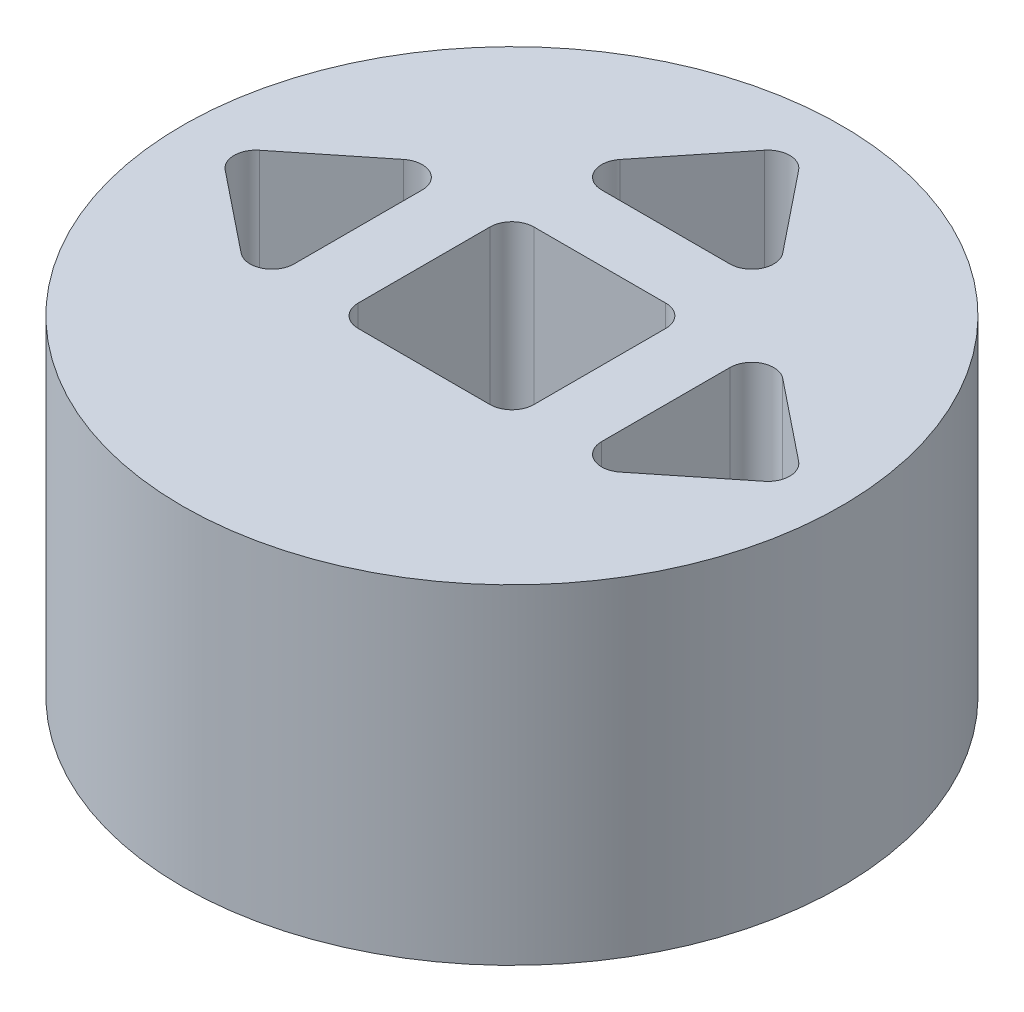
ISO-10303-21;
HEADER;
FILE_DESCRIPTION(('STEP AP214'),'2;1');
FILE_NAME('part.step','',(''),(''),'','','');
FILE_SCHEMA(('AUTOMOTIVE_DESIGN { 1 0 10303 214 1 1 1 1 }'));
ENDSEC;
DATA;
#1=APPLICATION_CONTEXT('core data for automotive mechanical design processes');
#2=APPLICATION_PROTOCOL_DEFINITION('international standard','automotive_design',2000,#1);
#3=PRODUCT_CONTEXT('',#1,'mechanical');
#4=PRODUCT('Part','Part','',(#3));
#5=PRODUCT_RELATED_PRODUCT_CATEGORY('part','',(#4));
#6=PRODUCT_DEFINITION_FORMATION('','',#4);
#7=PRODUCT_DEFINITION_CONTEXT('part definition',#1,'design');
#8=PRODUCT_DEFINITION('design','',#6,#7);
#9=PRODUCT_DEFINITION_SHAPE('','',#8);
#10=(LENGTH_UNIT() NAMED_UNIT(*) SI_UNIT(.MILLI.,.METRE.));
#11=(NAMED_UNIT(*) PLANE_ANGLE_UNIT() SI_UNIT($,.RADIAN.));
#12=(NAMED_UNIT(*) SI_UNIT($,.STERADIAN.) SOLID_ANGLE_UNIT());
#13=UNCERTAINTY_MEASURE_WITH_UNIT(LENGTH_MEASURE(1.E-05),#10,'distance_accuracy_value','');
#14=(GEOMETRIC_REPRESENTATION_CONTEXT(3) GLOBAL_UNCERTAINTY_ASSIGNED_CONTEXT((#13)) GLOBAL_UNIT_ASSIGNED_CONTEXT((#10,
#11,#12)) REPRESENTATION_CONTEXT('',''));
#15=CARTESIAN_POINT('',(0.,0.,0.));
#16=DIRECTION('',(0.,0.,1.));
#17=DIRECTION('',(1.,0.,0.));
#18=AXIS2_PLACEMENT_3D('',#15,#16,#17);
#19=CARTESIAN_POINT('',(0.,15.,0.));
#20=DIRECTION('',(0.,-1.,0.));
#21=DIRECTION('',(0.,0.,-1.));
#22=AXIS2_PLACEMENT_3D('',#19,#20,#21);
#23=CYLINDRICAL_SURFACE('',#22,15.);
#24=CARTESIAN_POINT('',(0.,15.,0.));
#25=DIRECTION('',(0.,1.,0.));
#26=DIRECTION('',(0.,0.,1.));
#27=AXIS2_PLACEMENT_3D('',#24,#25,#26);
#28=CIRCLE('',#27,15.);
#29=CARTESIAN_POINT('',(0.,15.,15.));
#30=VERTEX_POINT('',#29);
#31=EDGE_CURVE('E11',#30,#30,#28,.T.);
#32=ORIENTED_EDGE('',*,*,#31,.F.);
#33=EDGE_LOOP('',(#32));
#34=FACE_BOUND('',#33,.T.);
#35=CARTESIAN_POINT('',(0.,0.,0.));
#36=DIRECTION('',(0.,1.,0.));
#37=DIRECTION('',(0.,0.,1.));
#38=AXIS2_PLACEMENT_3D('',#35,#36,#37);
#39=CIRCLE('',#38,15.);
#40=CARTESIAN_POINT('',(0.,0.,15.));
#41=VERTEX_POINT('',#40);
#42=EDGE_CURVE('E35',#41,#41,#39,.T.);
#43=ORIENTED_EDGE('',*,*,#42,.T.);
#44=EDGE_LOOP('',(#43));
#45=FACE_BOUND('',#44,.T.);
#46=ADVANCED_FACE('F32',(#34,#45),#23,.T.);
#47=CARTESIAN_POINT('',(0.,15.,0.));
#48=DIRECTION('',(0.,1.,0.));
#49=DIRECTION('',(0.,0.,1.));
#50=AXIS2_PLACEMENT_3D('',#47,#48,#49);
#51=PLANE('',#50);
#52=CARTESIAN_POINT('',(-8.,15.,2.91833400053387));
#53=DIRECTION('',(0.,1.,0.));
#54=DIRECTION('',(0.,0.,1.));
#55=AXIS2_PLACEMENT_3D('',#52,#53,#54);
#56=CIRCLE('',#55,1.);
#57=CARTESIAN_POINT('',(-8.62500000000001,15.,3.69895875033366));
#58=VERTEX_POINT('',#57);
#59=CARTESIAN_POINT('',(-7.,15.,2.91833400053385));
#60=VERTEX_POINT('',#59);
#61=EDGE_CURVE('E46',#58,#60,#56,.T.);
#62=ORIENTED_EDGE('',*,*,#61,.F.);
#63=DIRECTION('',(0.7806247497998,0.,0.625));
#64=VECTOR('',#63,1.);
#65=CARTESIAN_POINT('',(-12.2699979983984,15.,0.780624749799806));
#66=LINE('',#65,#64);
#67=CARTESIAN_POINT('',(-12.2699979983984,15.,0.780624749799806));
#68=VERTEX_POINT('',#67);
#69=EDGE_CURVE('E223',#68,#58,#66,.T.);
#70=ORIENTED_EDGE('',*,*,#69,.F.);
#71=CARTESIAN_POINT('',(-11.6449979983984,15.,0.));
#72=DIRECTION('',(0.,1.,0.));
#73=DIRECTION('',(0.,0.,1.));
#74=AXIS2_PLACEMENT_3D('',#71,#72,#73);
#75=CIRCLE('',#74,0.999999999999999);
#76=CARTESIAN_POINT('',(-12.2699979983984,15.,-0.780624749799804));
#77=VERTEX_POINT('',#76);
#78=EDGE_CURVE('E226',#77,#68,#75,.T.);
#79=ORIENTED_EDGE('',*,*,#78,.F.);
#80=DIRECTION('',(-0.7806247497998,0.,0.625));
#81=VECTOR('',#80,1.);
#82=CARTESIAN_POINT('',(-8.62500000000002,15.,-3.69895875033366));
#83=LINE('',#82,#81);
#84=CARTESIAN_POINT('',(-8.62500000000002,15.,-3.69895875033366));
#85=VERTEX_POINT('',#84);
#86=EDGE_CURVE('E242',#85,#77,#83,.T.);
#87=ORIENTED_EDGE('',*,*,#86,.F.);
#88=CARTESIAN_POINT('',(-8.,15.,-2.91833400053387));
#89=DIRECTION('',(0.,1.,0.));
#90=DIRECTION('',(0.,0.,-1.));
#91=AXIS2_PLACEMENT_3D('',#88,#89,#90);
#92=CIRCLE('',#91,1.);
#93=CARTESIAN_POINT('',(-7.,15.,-2.91833400053385));
#94=VERTEX_POINT('',#93);
#95=EDGE_CURVE('E239',#94,#85,#92,.T.);
#96=ORIENTED_EDGE('',*,*,#95,.F.);
#97=DIRECTION('',(0.,0.,-1.));
#98=VECTOR('',#97,1.);
#99=CARTESIAN_POINT('',(-7.,15.,2.91833400053385));
#100=LINE('',#99,#98);
#101=EDGE_CURVE('E237',#60,#94,#100,.T.);
#102=ORIENTED_EDGE('',*,*,#101,.F.);
#103=EDGE_LOOP('',(#62,#70,#79,#87,#96,#102));
#104=FACE_BOUND('',#103,.T.);
#105=CARTESIAN_POINT('',(2.91833400053387,15.,-8.));
#106=DIRECTION('',(0.,1.,0.));
#107=DIRECTION('',(0.,0.,1.));
#108=AXIS2_PLACEMENT_3D('',#105,#106,#107);
#109=CIRCLE('',#108,1.);
#110=CARTESIAN_POINT('',(2.91833400053385,15.,-7.));
#111=VERTEX_POINT('',#110);
#112=CARTESIAN_POINT('',(3.69895875033366,15.,-8.62500000000002));
#113=VERTEX_POINT('',#112);
#114=EDGE_CURVE('E249',#111,#113,#109,.T.);
#115=ORIENTED_EDGE('',*,*,#114,.F.);
#116=DIRECTION('',(1.,0.,0.));
#117=VECTOR('',#116,1.);
#118=CARTESIAN_POINT('',(-2.91833400053385,15.,-7.));
#119=LINE('',#118,#117);
#120=CARTESIAN_POINT('',(-2.91833400053385,15.,-7.));
#121=VERTEX_POINT('',#120);
#122=EDGE_CURVE('E261',#121,#111,#119,.T.);
#123=ORIENTED_EDGE('',*,*,#122,.F.);
#124=CARTESIAN_POINT('',(-2.91833400053386,15.,-8.));
#125=DIRECTION('',(0.,1.,0.));
#126=DIRECTION('',(0.,0.,1.));
#127=AXIS2_PLACEMENT_3D('',#124,#125,#126);
#128=CIRCLE('',#127,1.);
#129=CARTESIAN_POINT('',(-3.69895875033365,15.,-8.62500000000002));
#130=VERTEX_POINT('',#129);
#131=EDGE_CURVE('E287',#130,#121,#128,.T.);
#132=ORIENTED_EDGE('',*,*,#131,.F.);
#133=DIRECTION('',(-0.625,0.,0.7806247497998));
#134=VECTOR('',#133,1.);
#135=CARTESIAN_POINT('',(-0.780624749799804,15.,-12.2699979983984));
#136=LINE('',#135,#134);
#137=CARTESIAN_POINT('',(-0.780624749799804,15.,-12.2699979983984));
#138=VERTEX_POINT('',#137);
#139=EDGE_CURVE('E284',#138,#130,#136,.T.);
#140=ORIENTED_EDGE('',*,*,#139,.F.);
#141=CARTESIAN_POINT('',(0.,15.,-11.6449979983984));
#142=DIRECTION('',(0.,1.,0.));
#143=DIRECTION('',(0.,0.,-1.));
#144=AXIS2_PLACEMENT_3D('',#141,#142,#143);
#145=CIRCLE('',#144,0.999999999999999);
#146=CARTESIAN_POINT('',(0.780624749799806,15.,-12.2699979983984));
#147=VERTEX_POINT('',#146);
#148=EDGE_CURVE('E281',#147,#138,#145,.T.);
#149=ORIENTED_EDGE('',*,*,#148,.F.);
#150=DIRECTION('',(-0.625,0.,-0.7806247497998));
#151=VECTOR('',#150,1.);
#152=CARTESIAN_POINT('',(3.69895875033366,15.,-8.62500000000002));
#153=LINE('',#152,#151);
#154=EDGE_CURVE('E278',#113,#147,#153,.T.);
#155=ORIENTED_EDGE('',*,*,#154,.F.);
#156=EDGE_LOOP('',(#115,#123,#132,#140,#149,#155));
#157=FACE_BOUND('',#156,.T.);
#158=CARTESIAN_POINT('',(8.,15.,2.91833400053387));
#159=DIRECTION('',(0.,1.,0.));
#160=DIRECTION('',(0.,0.,-1.));
#161=AXIS2_PLACEMENT_3D('',#158,#159,#160);
#162=CIRCLE('',#161,1.);
#163=CARTESIAN_POINT('',(7.,15.,2.91833400053385));
#164=VERTEX_POINT('',#163);
#165=CARTESIAN_POINT('',(8.62500000000002,15.,3.69895875033366));
#166=VERTEX_POINT('',#165);
#167=EDGE_CURVE('E294',#164,#166,#162,.T.);
#168=ORIENTED_EDGE('',*,*,#167,.F.);
#169=DIRECTION('',(0.,0.,1.));
#170=VECTOR('',#169,1.);
#171=CARTESIAN_POINT('',(7.,15.,-2.91833400053385));
#172=LINE('',#171,#170);
#173=CARTESIAN_POINT('',(7.,15.,-2.91833400053385));
#174=VERTEX_POINT('',#173);
#175=EDGE_CURVE('E309',#174,#164,#172,.T.);
#176=ORIENTED_EDGE('',*,*,#175,.F.);
#177=CARTESIAN_POINT('',(8.,15.,-2.91833400053387));
#178=DIRECTION('',(0.,1.,0.));
#179=DIRECTION('',(0.,0.,1.));
#180=AXIS2_PLACEMENT_3D('',#177,#178,#179);
#181=CIRCLE('',#180,1.);
#182=CARTESIAN_POINT('',(8.62500000000002,15.,-3.69895875033365));
#183=VERTEX_POINT('',#182);
#184=EDGE_CURVE('E335',#183,#174,#181,.T.);
#185=ORIENTED_EDGE('',*,*,#184,.F.);
#186=DIRECTION('',(-0.7806247497998,0.,-0.625));
#187=VECTOR('',#186,1.);
#188=CARTESIAN_POINT('',(12.2699979983984,15.,-0.780624749799805));
#189=LINE('',#188,#187);
#190=CARTESIAN_POINT('',(12.2699979983984,15.,-0.780624749799805));
#191=VERTEX_POINT('',#190);
#192=EDGE_CURVE('E332',#191,#183,#189,.T.);
#193=ORIENTED_EDGE('',*,*,#192,.F.);
#194=CARTESIAN_POINT('',(11.6449979983984,15.,0.));
#195=DIRECTION('',(0.,1.,0.));
#196=DIRECTION('',(0.,0.,1.));
#197=AXIS2_PLACEMENT_3D('',#194,#195,#196);
#198=CIRCLE('',#197,0.999999999999999);
#199=CARTESIAN_POINT('',(12.2699979983984,15.,0.780624749799805));
#200=VERTEX_POINT('',#199);
#201=EDGE_CURVE('E329',#200,#191,#198,.T.);
#202=ORIENTED_EDGE('',*,*,#201,.F.);
#203=DIRECTION('',(0.7806247497998,0.,-0.625));
#204=VECTOR('',#203,1.);
#205=CARTESIAN_POINT('',(8.62500000000002,15.,3.69895875033366));
#206=LINE('',#205,#204);
#207=EDGE_CURVE('E326',#166,#200,#206,.T.);
#208=ORIENTED_EDGE('',*,*,#207,.F.);
#209=EDGE_LOOP('',(#168,#176,#185,#193,#202,#208));
#210=FACE_BOUND('',#209,.T.);
#211=CARTESIAN_POINT('',(-3.,15.,3.));
#212=DIRECTION('',(0.,1.,0.));
#213=DIRECTION('',(0.,0.,-1.));
#214=AXIS2_PLACEMENT_3D('',#211,#212,#213);
#215=CIRCLE('',#214,1.);
#216=CARTESIAN_POINT('',(-4.,15.,2.99999999999999));
#217=VERTEX_POINT('',#216);
#218=CARTESIAN_POINT('',(-2.99999999999999,15.,4.));
#219=VERTEX_POINT('',#218);
#220=EDGE_CURVE('E342',#217,#219,#215,.T.);
#221=ORIENTED_EDGE('',*,*,#220,.F.);
#222=DIRECTION('',(0.,0.,1.));
#223=VECTOR('',#222,1.);
#224=CARTESIAN_POINT('',(-4.,15.,2.99999999999999));
#225=LINE('',#224,#223);
#226=CARTESIAN_POINT('',(-4.,15.,-2.99999999999999));
#227=VERTEX_POINT('',#226);
#228=EDGE_CURVE('E357',#227,#217,#225,.T.);
#229=ORIENTED_EDGE('',*,*,#228,.F.);
#230=CARTESIAN_POINT('',(-3.,15.,-3.));
#231=DIRECTION('',(0.,1.,0.));
#232=DIRECTION('',(0.,0.,-1.));
#233=AXIS2_PLACEMENT_3D('',#230,#231,#232);
#234=CIRCLE('',#233,1.);
#235=CARTESIAN_POINT('',(-2.99999999999999,15.,-4.));
#236=VERTEX_POINT('',#235);
#237=EDGE_CURVE('E395',#236,#227,#234,.T.);
#238=ORIENTED_EDGE('',*,*,#237,.F.);
#239=DIRECTION('',(-1.,0.,0.));
#240=VECTOR('',#239,1.);
#241=CARTESIAN_POINT('',(-2.99999999999999,15.,-4.));
#242=LINE('',#241,#240);
#243=CARTESIAN_POINT('',(2.99999999999999,15.,-4.));
#244=VERTEX_POINT('',#243);
#245=EDGE_CURVE('E392',#244,#236,#242,.T.);
#246=ORIENTED_EDGE('',*,*,#245,.F.);
#247=CARTESIAN_POINT('',(3.,15.,-3.));
#248=DIRECTION('',(0.,1.,0.));
#249=DIRECTION('',(0.,0.,-1.));
#250=AXIS2_PLACEMENT_3D('',#247,#248,#249);
#251=CIRCLE('',#250,1.);
#252=CARTESIAN_POINT('',(4.,15.,-2.99999999999999));
#253=VERTEX_POINT('',#252);
#254=EDGE_CURVE('E389',#253,#244,#251,.T.);
#255=ORIENTED_EDGE('',*,*,#254,.F.);
#256=DIRECTION('',(0.,0.,-1.));
#257=VECTOR('',#256,1.);
#258=CARTESIAN_POINT('',(4.,15.,2.99999999999999));
#259=LINE('',#258,#257);
#260=CARTESIAN_POINT('',(4.,15.,2.99999999999999));
#261=VERTEX_POINT('',#260);
#262=EDGE_CURVE('E386',#261,#253,#259,.T.);
#263=ORIENTED_EDGE('',*,*,#262,.F.);
#264=CARTESIAN_POINT('',(3.,15.,3.));
#265=DIRECTION('',(0.,1.,0.));
#266=DIRECTION('',(0.,0.,1.));
#267=AXIS2_PLACEMENT_3D('',#264,#265,#266);
#268=CIRCLE('',#267,1.);
#269=CARTESIAN_POINT('',(2.99999999999999,15.,4.));
#270=VERTEX_POINT('',#269);
#271=EDGE_CURVE('E383',#270,#261,#268,.T.);
#272=ORIENTED_EDGE('',*,*,#271,.F.);
#273=DIRECTION('',(1.,0.,0.));
#274=VECTOR('',#273,1.);
#275=CARTESIAN_POINT('',(-2.99999999999999,15.,4.));
#276=LINE('',#275,#274);
#277=EDGE_CURVE('E380',#219,#270,#276,.T.);
#278=ORIENTED_EDGE('',*,*,#277,.F.);
#279=EDGE_LOOP('',(#221,#229,#238,#246,#255,#263,#272,#278));
#280=FACE_BOUND('',#279,.T.);
#281=ORIENTED_EDGE('',*,*,#31,.T.);
#282=EDGE_LOOP('',(#281));
#283=FACE_BOUND('',#282,.T.);
#284=ADVANCED_FACE('F425',(#104,#157,#210,#280,#283),#51,.T.);
#285=CARTESIAN_POINT('',(0.,0.,0.));
#286=DIRECTION('',(0.,1.,0.));
#287=DIRECTION('',(0.,0.,1.));
#288=AXIS2_PLACEMENT_3D('',#285,#286,#287);
#289=PLANE('',#288);
#290=DIRECTION('',(0.7806247497998,0.,0.625));
#291=VECTOR('',#290,1.);
#292=CARTESIAN_POINT('',(-12.2699979983984,0.,0.780624749799806));
#293=LINE('',#292,#291);
#294=CARTESIAN_POINT('',(-12.2699979983984,0.,0.780624749799806));
#295=VERTEX_POINT('',#294);
#296=CARTESIAN_POINT('',(-8.62500000000001,0.,3.69895875033366));
#297=VERTEX_POINT('',#296);
#298=EDGE_CURVE('E212',#295,#297,#293,.T.);
#299=ORIENTED_EDGE('',*,*,#298,.T.);
#300=CARTESIAN_POINT('',(-8.,0.,2.91833400053387));
#301=DIRECTION('',(0.,1.,0.));
#302=DIRECTION('',(0.,0.,1.));
#303=AXIS2_PLACEMENT_3D('',#300,#301,#302);
#304=CIRCLE('',#303,1.);
#305=CARTESIAN_POINT('',(-7.,0.,2.91833400053385));
#306=VERTEX_POINT('',#305);
#307=EDGE_CURVE('E206',#297,#306,#304,.T.);
#308=ORIENTED_EDGE('',*,*,#307,.T.);
#309=DIRECTION('',(0.,0.,-1.));
#310=VECTOR('',#309,1.);
#311=CARTESIAN_POINT('',(-7.,0.,2.91833400053385));
#312=LINE('',#311,#310);
#313=CARTESIAN_POINT('',(-7.,0.,-2.91833400053385));
#314=VERTEX_POINT('',#313);
#315=EDGE_CURVE('E215',#306,#314,#312,.T.);
#316=ORIENTED_EDGE('',*,*,#315,.T.);
#317=CARTESIAN_POINT('',(-8.,0.,-2.91833400053387));
#318=DIRECTION('',(0.,1.,0.));
#319=DIRECTION('',(0.,0.,-1.));
#320=AXIS2_PLACEMENT_3D('',#317,#318,#319);
#321=CIRCLE('',#320,1.);
#322=CARTESIAN_POINT('',(-8.62500000000002,0.,-3.69895875033366));
#323=VERTEX_POINT('',#322);
#324=EDGE_CURVE('E54',#314,#323,#321,.T.);
#325=ORIENTED_EDGE('',*,*,#324,.T.);
#326=DIRECTION('',(-0.7806247497998,0.,0.625));
#327=VECTOR('',#326,1.);
#328=CARTESIAN_POINT('',(-8.62500000000002,0.,-3.69895875033366));
#329=LINE('',#328,#327);
#330=CARTESIAN_POINT('',(-12.2699979983984,0.,-0.780624749799804));
#331=VERTEX_POINT('',#330);
#332=EDGE_CURVE('E230',#323,#331,#329,.T.);
#333=ORIENTED_EDGE('',*,*,#332,.T.);
#334=CARTESIAN_POINT('',(-11.6449979983984,0.,0.));
#335=DIRECTION('',(0.,1.,0.));
#336=DIRECTION('',(0.,0.,1.));
#337=AXIS2_PLACEMENT_3D('',#334,#335,#336);
#338=CIRCLE('',#337,0.999999999999999);
#339=EDGE_CURVE('E233',#331,#295,#338,.T.);
#340=ORIENTED_EDGE('',*,*,#339,.T.);
#341=EDGE_LOOP('',(#299,#308,#316,#325,#333,#340));
#342=FACE_BOUND('',#341,.T.);
#343=DIRECTION('',(1.,0.,0.));
#344=VECTOR('',#343,1.);
#345=CARTESIAN_POINT('',(-2.91833400053385,0.,-7.));
#346=LINE('',#345,#344);
#347=CARTESIAN_POINT('',(-2.91833400053385,0.,-7.));
#348=VERTEX_POINT('',#347);
#349=CARTESIAN_POINT('',(2.91833400053385,0.,-7.));
#350=VERTEX_POINT('',#349);
#351=EDGE_CURVE('E273',#348,#350,#346,.T.);
#352=ORIENTED_EDGE('',*,*,#351,.T.);
#353=CARTESIAN_POINT('',(2.91833400053387,0.,-8.));
#354=DIRECTION('',(0.,1.,0.));
#355=DIRECTION('',(0.,0.,1.));
#356=AXIS2_PLACEMENT_3D('',#353,#354,#355);
#357=CIRCLE('',#356,1.);
#358=CARTESIAN_POINT('',(3.69895875033366,0.,-8.62500000000002));
#359=VERTEX_POINT('',#358);
#360=EDGE_CURVE('E257',#350,#359,#357,.T.);
#361=ORIENTED_EDGE('',*,*,#360,.T.);
#362=DIRECTION('',(-0.625,0.,-0.7806247497998));
#363=VECTOR('',#362,1.);
#364=CARTESIAN_POINT('',(3.69895875033366,0.,-8.62500000000002));
#365=LINE('',#364,#363);
#366=CARTESIAN_POINT('',(0.780624749799808,0.,-12.2699979983984));
#367=VERTEX_POINT('',#366);
#368=EDGE_CURVE('E260',#359,#367,#365,.T.);
#369=ORIENTED_EDGE('',*,*,#368,.T.);
#370=CARTESIAN_POINT('',(0.,0.,-11.6449979983984));
#371=DIRECTION('',(0.,1.,0.));
#372=DIRECTION('',(0.,0.,-1.));
#373=AXIS2_PLACEMENT_3D('',#370,#371,#372);
#374=CIRCLE('',#373,0.999999999999999);
#375=CARTESIAN_POINT('',(-0.780624749799804,0.,-12.2699979983984));
#376=VERTEX_POINT('',#375);
#377=EDGE_CURVE('E264',#367,#376,#374,.T.);
#378=ORIENTED_EDGE('',*,*,#377,.T.);
#379=DIRECTION('',(-0.625,0.,0.7806247497998));
#380=VECTOR('',#379,1.);
#381=CARTESIAN_POINT('',(-0.780624749799804,0.,-12.2699979983984));
#382=LINE('',#381,#380);
#383=CARTESIAN_POINT('',(-3.69895875033365,0.,-8.62500000000002));
#384=VERTEX_POINT('',#383);
#385=EDGE_CURVE('E267',#376,#384,#382,.T.);
#386=ORIENTED_EDGE('',*,*,#385,.T.);
#387=CARTESIAN_POINT('',(-2.91833400053386,0.,-8.));
#388=DIRECTION('',(0.,1.,0.));
#389=DIRECTION('',(0.,0.,1.));
#390=AXIS2_PLACEMENT_3D('',#387,#388,#389);
#391=CIRCLE('',#390,1.);
#392=EDGE_CURVE('E270',#384,#348,#391,.T.);
#393=ORIENTED_EDGE('',*,*,#392,.T.);
#394=EDGE_LOOP('',(#352,#361,#369,#378,#386,#393));
#395=FACE_BOUND('',#394,.T.);
#396=DIRECTION('',(0.,0.,1.));
#397=VECTOR('',#396,1.);
#398=CARTESIAN_POINT('',(7.,0.,-2.91833400053385));
#399=LINE('',#398,#397);
#400=CARTESIAN_POINT('',(7.,0.,-2.91833400053385));
#401=VERTEX_POINT('',#400);
#402=CARTESIAN_POINT('',(7.,0.,2.91833400053385));
#403=VERTEX_POINT('',#402);
#404=EDGE_CURVE('E321',#401,#403,#399,.T.);
#405=ORIENTED_EDGE('',*,*,#404,.T.);
#406=CARTESIAN_POINT('',(8.,0.,2.91833400053387));
#407=DIRECTION('',(0.,1.,0.));
#408=DIRECTION('',(0.,0.,-1.));
#409=AXIS2_PLACEMENT_3D('',#406,#407,#408);
#410=CIRCLE('',#409,1.);
#411=CARTESIAN_POINT('',(8.62500000000002,0.,3.69895875033366));
#412=VERTEX_POINT('',#411);
#413=EDGE_CURVE('E305',#403,#412,#410,.T.);
#414=ORIENTED_EDGE('',*,*,#413,.T.);
#415=DIRECTION('',(0.7806247497998,0.,-0.625));
#416=VECTOR('',#415,1.);
#417=CARTESIAN_POINT('',(8.62500000000002,0.,3.69895875033366));
#418=LINE('',#417,#416);
#419=CARTESIAN_POINT('',(12.2699979983984,0.,0.780624749799804));
#420=VERTEX_POINT('',#419);
#421=EDGE_CURVE('E308',#412,#420,#418,.T.);
#422=ORIENTED_EDGE('',*,*,#421,.T.);
#423=CARTESIAN_POINT('',(11.6449979983984,0.,0.));
#424=DIRECTION('',(0.,1.,0.));
#425=DIRECTION('',(0.,0.,1.));
#426=AXIS2_PLACEMENT_3D('',#423,#424,#425);
#427=CIRCLE('',#426,0.999999999999999);
#428=CARTESIAN_POINT('',(12.2699979983984,0.,-0.780624749799805));
#429=VERTEX_POINT('',#428);
#430=EDGE_CURVE('E312',#420,#429,#427,.T.);
#431=ORIENTED_EDGE('',*,*,#430,.T.);
#432=DIRECTION('',(-0.7806247497998,0.,-0.625));
#433=VECTOR('',#432,1.);
#434=CARTESIAN_POINT('',(12.2699979983984,0.,-0.780624749799805));
#435=LINE('',#434,#433);
#436=CARTESIAN_POINT('',(8.62500000000002,0.,-3.69895875033365));
#437=VERTEX_POINT('',#436);
#438=EDGE_CURVE('E315',#429,#437,#435,.T.);
#439=ORIENTED_EDGE('',*,*,#438,.T.);
#440=CARTESIAN_POINT('',(8.,0.,-2.91833400053387));
#441=DIRECTION('',(0.,1.,0.));
#442=DIRECTION('',(0.,0.,1.));
#443=AXIS2_PLACEMENT_3D('',#440,#441,#442);
#444=CIRCLE('',#443,1.);
#445=EDGE_CURVE('E318',#437,#401,#444,.T.);
#446=ORIENTED_EDGE('',*,*,#445,.T.);
#447=EDGE_LOOP('',(#405,#414,#422,#431,#439,#446));
#448=FACE_BOUND('',#447,.T.);
#449=DIRECTION('',(0.,0.,1.));
#450=VECTOR('',#449,1.);
#451=CARTESIAN_POINT('',(-4.,0.,2.99999999999999));
#452=LINE('',#451,#450);
#453=CARTESIAN_POINT('',(-4.,0.,-2.99999999999999));
#454=VERTEX_POINT('',#453);
#455=CARTESIAN_POINT('',(-4.,0.,2.99999999999999));
#456=VERTEX_POINT('',#455);
#457=EDGE_CURVE('E375',#454,#456,#452,.T.);
#458=ORIENTED_EDGE('',*,*,#457,.T.);
#459=CARTESIAN_POINT('',(-3.,0.,3.));
#460=DIRECTION('',(0.,1.,0.));
#461=DIRECTION('',(0.,0.,-1.));
#462=AXIS2_PLACEMENT_3D('',#459,#460,#461);
#463=CIRCLE('',#462,1.);
#464=CARTESIAN_POINT('',(-2.99999999999999,0.,4.));
#465=VERTEX_POINT('',#464);
#466=EDGE_CURVE('E353',#456,#465,#463,.T.);
#467=ORIENTED_EDGE('',*,*,#466,.T.);
#468=DIRECTION('',(1.,0.,0.));
#469=VECTOR('',#468,1.);
#470=CARTESIAN_POINT('',(-2.99999999999999,0.,4.));
#471=LINE('',#470,#469);
#472=CARTESIAN_POINT('',(2.99999999999999,0.,4.));
#473=VERTEX_POINT('',#472);
#474=EDGE_CURVE('E356',#465,#473,#471,.T.);
#475=ORIENTED_EDGE('',*,*,#474,.T.);
#476=CARTESIAN_POINT('',(3.,0.,3.));
#477=DIRECTION('',(0.,1.,0.));
#478=DIRECTION('',(0.,0.,1.));
#479=AXIS2_PLACEMENT_3D('',#476,#477,#478);
#480=CIRCLE('',#479,1.);
#481=CARTESIAN_POINT('',(4.,0.,2.99999999999999));
#482=VERTEX_POINT('',#481);
#483=EDGE_CURVE('E360',#473,#482,#480,.T.);
#484=ORIENTED_EDGE('',*,*,#483,.T.);
#485=DIRECTION('',(0.,0.,-1.));
#486=VECTOR('',#485,1.);
#487=CARTESIAN_POINT('',(4.,0.,2.99999999999999));
#488=LINE('',#487,#486);
#489=CARTESIAN_POINT('',(4.,0.,-2.99999999999999));
#490=VERTEX_POINT('',#489);
#491=EDGE_CURVE('E363',#482,#490,#488,.T.);
#492=ORIENTED_EDGE('',*,*,#491,.T.);
#493=CARTESIAN_POINT('',(3.,0.,-3.));
#494=DIRECTION('',(0.,1.,0.));
#495=DIRECTION('',(0.,0.,-1.));
#496=AXIS2_PLACEMENT_3D('',#493,#494,#495);
#497=CIRCLE('',#496,1.);
#498=CARTESIAN_POINT('',(2.99999999999999,0.,-4.));
#499=VERTEX_POINT('',#498);
#500=EDGE_CURVE('E366',#490,#499,#497,.T.);
#501=ORIENTED_EDGE('',*,*,#500,.T.);
#502=DIRECTION('',(-1.,0.,0.));
#503=VECTOR('',#502,1.);
#504=CARTESIAN_POINT('',(-2.99999999999999,0.,-4.));
#505=LINE('',#504,#503);
#506=CARTESIAN_POINT('',(-2.99999999999999,0.,-4.));
#507=VERTEX_POINT('',#506);
#508=EDGE_CURVE('E369',#499,#507,#505,.T.);
#509=ORIENTED_EDGE('',*,*,#508,.T.);
#510=CARTESIAN_POINT('',(-3.,0.,-3.));
#511=DIRECTION('',(0.,1.,0.));
#512=DIRECTION('',(0.,0.,-1.));
#513=AXIS2_PLACEMENT_3D('',#510,#511,#512);
#514=CIRCLE('',#513,1.);
#515=EDGE_CURVE('E372',#507,#454,#514,.T.);
#516=ORIENTED_EDGE('',*,*,#515,.T.);
#517=EDGE_LOOP('',(#458,#467,#475,#484,#492,#501,#509,#516));
#518=FACE_BOUND('',#517,.T.);
#519=ORIENTED_EDGE('',*,*,#42,.F.);
#520=EDGE_LOOP('',(#519));
#521=FACE_BOUND('',#520,.T.);
#522=ADVANCED_FACE('F219',(#342,#395,#448,#518,#521),#289,.F.);
#523=CARTESIAN_POINT('',(-3.,0.,3.));
#524=DIRECTION('',(0.,1.,0.));
#525=DIRECTION('',(0.,0.,1.));
#526=AXIS2_PLACEMENT_3D('',#523,#524,#525);
#527=CYLINDRICAL_SURFACE('',#526,1.);
#528=ORIENTED_EDGE('',*,*,#220,.T.);
#529=DIRECTION('',(0.,1.,0.));
#530=VECTOR('',#529,1.);
#531=CARTESIAN_POINT('',(-2.99999999999999,0.,4.));
#532=LINE('',#531,#530);
#533=EDGE_CURVE('E378',#465,#219,#532,.T.);
#534=ORIENTED_EDGE('',*,*,#533,.F.);
#535=ORIENTED_EDGE('',*,*,#466,.F.);
#536=DIRECTION('',(0.,1.,0.));
#537=VECTOR('',#536,1.);
#538=CARTESIAN_POINT('',(-4.,0.,2.99999999999999));
#539=LINE('',#538,#537);
#540=EDGE_CURVE('E400',#456,#217,#539,.T.);
#541=ORIENTED_EDGE('',*,*,#540,.T.);
#542=EDGE_LOOP('',(#528,#534,#535,#541));
#543=FACE_BOUND('',#542,.T.);
#544=ADVANCED_FACE('F436',(#543),#527,.F.);
#545=CARTESIAN_POINT('',(-4.,0.,2.99999999999999));
#546=DIRECTION('',(-1.,0.,0.));
#547=DIRECTION('',(0.,0.,1.));
#548=AXIS2_PLACEMENT_3D('',#545,#546,#547);
#549=PLANE('',#548);
#550=ORIENTED_EDGE('',*,*,#228,.T.);
#551=ORIENTED_EDGE('',*,*,#540,.F.);
#552=ORIENTED_EDGE('',*,*,#457,.F.);
#553=DIRECTION('',(0.,1.,0.));
#554=VECTOR('',#553,1.);
#555=CARTESIAN_POINT('',(-4.,0.,-2.99999999999999));
#556=LINE('',#555,#554);
#557=EDGE_CURVE('E402',#454,#227,#556,.T.);
#558=ORIENTED_EDGE('',*,*,#557,.T.);
#559=EDGE_LOOP('',(#550,#551,#552,#558));
#560=FACE_BOUND('',#559,.T.);
#561=ADVANCED_FACE('F438',(#560),#549,.F.);
#562=CARTESIAN_POINT('',(-3.,0.,-3.));
#563=DIRECTION('',(0.,1.,0.));
#564=DIRECTION('',(0.,0.,1.));
#565=AXIS2_PLACEMENT_3D('',#562,#563,#564);
#566=CYLINDRICAL_SURFACE('',#565,1.);
#567=ORIENTED_EDGE('',*,*,#237,.T.);
#568=ORIENTED_EDGE('',*,*,#557,.F.);
#569=ORIENTED_EDGE('',*,*,#515,.F.);
#570=DIRECTION('',(0.,1.,0.));
#571=VECTOR('',#570,1.);
#572=CARTESIAN_POINT('',(-2.99999999999999,0.,-4.));
#573=LINE('',#572,#571);
#574=EDGE_CURVE('E404',#507,#236,#573,.T.);
#575=ORIENTED_EDGE('',*,*,#574,.T.);
#576=EDGE_LOOP('',(#567,#568,#569,#575));
#577=FACE_BOUND('',#576,.T.);
#578=ADVANCED_FACE('F442',(#577),#566,.F.);
#579=CARTESIAN_POINT('',(-2.99999999999999,0.,-4.));
#580=DIRECTION('',(0.,0.,-1.));
#581=DIRECTION('',(-1.,0.,0.));
#582=AXIS2_PLACEMENT_3D('',#579,#580,#581);
#583=PLANE('',#582);
#584=ORIENTED_EDGE('',*,*,#245,.T.);
#585=ORIENTED_EDGE('',*,*,#574,.F.);
#586=ORIENTED_EDGE('',*,*,#508,.F.);
#587=DIRECTION('',(0.,1.,0.));
#588=VECTOR('',#587,1.);
#589=CARTESIAN_POINT('',(2.99999999999999,0.,-4.));
#590=LINE('',#589,#588);
#591=EDGE_CURVE('E406',#499,#244,#590,.T.);
#592=ORIENTED_EDGE('',*,*,#591,.T.);
#593=EDGE_LOOP('',(#584,#585,#586,#592));
#594=FACE_BOUND('',#593,.T.);
#595=ADVANCED_FACE('F446',(#594),#583,.F.);
#596=CARTESIAN_POINT('',(3.,0.,-3.));
#597=DIRECTION('',(0.,1.,0.));
#598=DIRECTION('',(0.,0.,1.));
#599=AXIS2_PLACEMENT_3D('',#596,#597,#598);
#600=CYLINDRICAL_SURFACE('',#599,1.);
#601=ORIENTED_EDGE('',*,*,#254,.T.);
#602=ORIENTED_EDGE('',*,*,#591,.F.);
#603=ORIENTED_EDGE('',*,*,#500,.F.);
#604=DIRECTION('',(0.,1.,0.));
#605=VECTOR('',#604,1.);
#606=CARTESIAN_POINT('',(4.,0.,-2.99999999999999));
#607=LINE('',#606,#605);
#608=EDGE_CURVE('E408',#490,#253,#607,.T.);
#609=ORIENTED_EDGE('',*,*,#608,.T.);
#610=EDGE_LOOP('',(#601,#602,#603,#609));
#611=FACE_BOUND('',#610,.T.);
#612=ADVANCED_FACE('F449',(#611),#600,.F.);
#613=CARTESIAN_POINT('',(4.,0.,2.99999999999999));
#614=DIRECTION('',(1.,0.,0.));
#615=DIRECTION('',(0.,0.,-1.));
#616=AXIS2_PLACEMENT_3D('',#613,#614,#615);
#617=PLANE('',#616);
#618=ORIENTED_EDGE('',*,*,#262,.T.);
#619=ORIENTED_EDGE('',*,*,#608,.F.);
#620=ORIENTED_EDGE('',*,*,#491,.F.);
#621=DIRECTION('',(0.,1.,0.));
#622=VECTOR('',#621,1.);
#623=CARTESIAN_POINT('',(4.,0.,2.99999999999999));
#624=LINE('',#623,#622);
#625=EDGE_CURVE('E410',#482,#261,#624,.T.);
#626=ORIENTED_EDGE('',*,*,#625,.T.);
#627=EDGE_LOOP('',(#618,#619,#620,#626));
#628=FACE_BOUND('',#627,.T.);
#629=ADVANCED_FACE('F451',(#628),#617,.F.);
#630=CARTESIAN_POINT('',(3.,0.,3.));
#631=DIRECTION('',(0.,1.,0.));
#632=DIRECTION('',(0.,0.,1.));
#633=AXIS2_PLACEMENT_3D('',#630,#631,#632);
#634=CYLINDRICAL_SURFACE('',#633,1.);
#635=ORIENTED_EDGE('',*,*,#271,.T.);
#636=ORIENTED_EDGE('',*,*,#625,.F.);
#637=ORIENTED_EDGE('',*,*,#483,.F.);
#638=DIRECTION('',(0.,1.,0.));
#639=VECTOR('',#638,1.);
#640=CARTESIAN_POINT('',(2.99999999999999,0.,4.));
#641=LINE('',#640,#639);
#642=EDGE_CURVE('E412',#473,#270,#641,.T.);
#643=ORIENTED_EDGE('',*,*,#642,.T.);
#644=EDGE_LOOP('',(#635,#636,#637,#643));
#645=FACE_BOUND('',#644,.T.);
#646=ADVANCED_FACE('F431',(#645),#634,.F.);
#647=CARTESIAN_POINT('',(-2.99999999999999,0.,4.));
#648=DIRECTION('',(0.,0.,1.));
#649=DIRECTION('',(1.,0.,0.));
#650=AXIS2_PLACEMENT_3D('',#647,#648,#649);
#651=PLANE('',#650);
#652=ORIENTED_EDGE('',*,*,#277,.T.);
#653=ORIENTED_EDGE('',*,*,#642,.F.);
#654=ORIENTED_EDGE('',*,*,#474,.F.);
#655=ORIENTED_EDGE('',*,*,#533,.T.);
#656=EDGE_LOOP('',(#652,#653,#654,#655));
#657=FACE_BOUND('',#656,.T.);
#658=ADVANCED_FACE('F418',(#657),#651,.F.);
#659=CARTESIAN_POINT('',(8.,0.,2.91833400053387));
#660=DIRECTION('',(0.,1.,0.));
#661=DIRECTION('',(0.,0.,1.));
#662=AXIS2_PLACEMENT_3D('',#659,#660,#661);
#663=CYLINDRICAL_SURFACE('',#662,1.);
#664=ORIENTED_EDGE('',*,*,#167,.T.);
#665=DIRECTION('',(0.,1.,0.));
#666=VECTOR('',#665,1.);
#667=CARTESIAN_POINT('',(8.62500000000002,0.,3.69895875033366));
#668=LINE('',#667,#666);
#669=EDGE_CURVE('E324',#412,#166,#668,.T.);
#670=ORIENTED_EDGE('',*,*,#669,.F.);
#671=ORIENTED_EDGE('',*,*,#413,.F.);
#672=DIRECTION('',(0.,1.,0.));
#673=VECTOR('',#672,1.);
#674=CARTESIAN_POINT('',(7.,0.,2.91833400053385));
#675=LINE('',#674,#673);
#676=EDGE_CURVE('E340',#403,#164,#675,.T.);
#677=ORIENTED_EDGE('',*,*,#676,.T.);
#678=EDGE_LOOP('',(#664,#670,#671,#677));
#679=FACE_BOUND('',#678,.T.);
#680=ADVANCED_FACE('F478',(#679),#663,.F.);
#681=CARTESIAN_POINT('',(7.,0.,-2.91833400053385));
#682=DIRECTION('',(-1.,0.,0.));
#683=DIRECTION('',(0.,0.,1.));
#684=AXIS2_PLACEMENT_3D('',#681,#682,#683);
#685=PLANE('',#684);
#686=ORIENTED_EDGE('',*,*,#175,.T.);
#687=ORIENTED_EDGE('',*,*,#676,.F.);
#688=ORIENTED_EDGE('',*,*,#404,.F.);
#689=DIRECTION('',(0.,1.,0.));
#690=VECTOR('',#689,1.);
#691=CARTESIAN_POINT('',(7.,0.,-2.91833400053385));
#692=LINE('',#691,#690);
#693=EDGE_CURVE('E343',#401,#174,#692,.T.);
#694=ORIENTED_EDGE('',*,*,#693,.T.);
#695=EDGE_LOOP('',(#686,#687,#688,#694));
#696=FACE_BOUND('',#695,.T.);
#697=ADVANCED_FACE('F482',(#696),#685,.F.);
#698=CARTESIAN_POINT('',(8.,0.,-2.91833400053387));
#699=DIRECTION('',(0.,1.,0.));
#700=DIRECTION('',(0.,0.,1.));
#701=AXIS2_PLACEMENT_3D('',#698,#699,#700);
#702=CYLINDRICAL_SURFACE('',#701,1.);
#703=ORIENTED_EDGE('',*,*,#184,.T.);
#704=ORIENTED_EDGE('',*,*,#693,.F.);
#705=ORIENTED_EDGE('',*,*,#445,.F.);
#706=DIRECTION('',(0.,1.,0.));
#707=VECTOR('',#706,1.);
#708=CARTESIAN_POINT('',(8.62500000000002,0.,-3.69895875033365));
#709=LINE('',#708,#707);
#710=EDGE_CURVE('E345',#437,#183,#709,.T.);
#711=ORIENTED_EDGE('',*,*,#710,.T.);
#712=EDGE_LOOP('',(#703,#704,#705,#711));
#713=FACE_BOUND('',#712,.T.);
#714=ADVANCED_FACE('F488',(#713),#702,.F.);
#715=CARTESIAN_POINT('',(12.2699979983984,0.,-0.780624749799805));
#716=DIRECTION('',(0.625,0.,-0.7806247497998));
#717=DIRECTION('',(-0.7806247497998,0.,-0.625));
#718=AXIS2_PLACEMENT_3D('',#715,#716,#717);
#719=PLANE('',#718);
#720=ORIENTED_EDGE('',*,*,#192,.T.);
#721=ORIENTED_EDGE('',*,*,#710,.F.);
#722=ORIENTED_EDGE('',*,*,#438,.F.);
#723=DIRECTION('',(0.,1.,0.));
#724=VECTOR('',#723,1.);
#725=CARTESIAN_POINT('',(12.2699979983984,0.,-0.780624749799805));
#726=LINE('',#725,#724);
#727=EDGE_CURVE('E347',#429,#191,#726,.T.);
#728=ORIENTED_EDGE('',*,*,#727,.T.);
#729=EDGE_LOOP('',(#720,#721,#722,#728));
#730=FACE_BOUND('',#729,.T.);
#731=ADVANCED_FACE('F541',(#730),#719,.F.);
#732=CARTESIAN_POINT('',(11.6449979983984,0.,0.));
#733=DIRECTION('',(0.,1.,0.));
#734=DIRECTION('',(0.,0.,1.));
#735=AXIS2_PLACEMENT_3D('',#732,#733,#734);
#736=CYLINDRICAL_SURFACE('',#735,0.999999999999999);
#737=ORIENTED_EDGE('',*,*,#201,.T.);
#738=ORIENTED_EDGE('',*,*,#727,.F.);
#739=ORIENTED_EDGE('',*,*,#430,.F.);
#740=DIRECTION('',(0.,1.,0.));
#741=VECTOR('',#740,1.);
#742=CARTESIAN_POINT('',(12.2699979983984,0.,0.780624749799805));
#743=LINE('',#742,#741);
#744=EDGE_CURVE('E349',#420,#200,#743,.T.);
#745=ORIENTED_EDGE('',*,*,#744,.T.);
#746=EDGE_LOOP('',(#737,#738,#739,#745));
#747=FACE_BOUND('',#746,.T.);
#748=ADVANCED_FACE('F551',(#747),#736,.F.);
#749=CARTESIAN_POINT('',(8.62500000000002,0.,3.69895875033366));
#750=DIRECTION('',(0.625,0.,0.780624749799799));
#751=DIRECTION('',(0.7806247497998,0.,-0.625));
#752=AXIS2_PLACEMENT_3D('',#749,#750,#751);
#753=PLANE('',#752);
#754=ORIENTED_EDGE('',*,*,#207,.T.);
#755=ORIENTED_EDGE('',*,*,#744,.F.);
#756=ORIENTED_EDGE('',*,*,#421,.F.);
#757=ORIENTED_EDGE('',*,*,#669,.T.);
#758=EDGE_LOOP('',(#754,#755,#756,#757));
#759=FACE_BOUND('',#758,.T.);
#760=ADVANCED_FACE('F493',(#759),#753,.F.);
#761=CARTESIAN_POINT('',(2.91833400053387,0.,-8.));
#762=DIRECTION('',(0.,1.,0.));
#763=DIRECTION('',(0.,0.,1.));
#764=AXIS2_PLACEMENT_3D('',#761,#762,#763);
#765=CYLINDRICAL_SURFACE('',#764,1.);
#766=ORIENTED_EDGE('',*,*,#114,.T.);
#767=DIRECTION('',(0.,1.,0.));
#768=VECTOR('',#767,1.);
#769=CARTESIAN_POINT('',(3.69895875033366,0.,-8.62500000000002));
#770=LINE('',#769,#768);
#771=EDGE_CURVE('E276',#359,#113,#770,.T.);
#772=ORIENTED_EDGE('',*,*,#771,.F.);
#773=ORIENTED_EDGE('',*,*,#360,.F.);
#774=DIRECTION('',(0.,1.,0.));
#775=VECTOR('',#774,1.);
#776=CARTESIAN_POINT('',(2.91833400053385,0.,-7.));
#777=LINE('',#776,#775);
#778=EDGE_CURVE('E292',#350,#111,#777,.T.);
#779=ORIENTED_EDGE('',*,*,#778,.T.);
#780=EDGE_LOOP('',(#766,#772,#773,#779));
#781=FACE_BOUND('',#780,.T.);
#782=ADVANCED_FACE('F569',(#781),#765,.F.);
#783=CARTESIAN_POINT('',(-2.91833400053385,0.,-7.));
#784=DIRECTION('',(0.,0.,1.));
#785=DIRECTION('',(1.,0.,0.));
#786=AXIS2_PLACEMENT_3D('',#783,#784,#785);
#787=PLANE('',#786);
#788=ORIENTED_EDGE('',*,*,#122,.T.);
#789=ORIENTED_EDGE('',*,*,#778,.F.);
#790=ORIENTED_EDGE('',*,*,#351,.F.);
#791=DIRECTION('',(0.,1.,0.));
#792=VECTOR('',#791,1.);
#793=CARTESIAN_POINT('',(-2.91833400053385,0.,-7.));
#794=LINE('',#793,#792);
#795=EDGE_CURVE('E295',#348,#121,#794,.T.);
#796=ORIENTED_EDGE('',*,*,#795,.T.);
#797=EDGE_LOOP('',(#788,#789,#790,#796));
#798=FACE_BOUND('',#797,.T.);
#799=ADVANCED_FACE('F578',(#798),#787,.F.);
#800=CARTESIAN_POINT('',(-2.91833400053386,0.,-8.));
#801=DIRECTION('',(0.,1.,0.));
#802=DIRECTION('',(0.,0.,1.));
#803=AXIS2_PLACEMENT_3D('',#800,#801,#802);
#804=CYLINDRICAL_SURFACE('',#803,1.);
#805=ORIENTED_EDGE('',*,*,#131,.T.);
#806=ORIENTED_EDGE('',*,*,#795,.F.);
#807=ORIENTED_EDGE('',*,*,#392,.F.);
#808=DIRECTION('',(0.,1.,0.));
#809=VECTOR('',#808,1.);
#810=CARTESIAN_POINT('',(-3.69895875033365,0.,-8.62500000000002));
#811=LINE('',#810,#809);
#812=EDGE_CURVE('E297',#384,#130,#811,.T.);
#813=ORIENTED_EDGE('',*,*,#812,.T.);
#814=EDGE_LOOP('',(#805,#806,#807,#813));
#815=FACE_BOUND('',#814,.T.);
#816=ADVANCED_FACE('F588',(#815),#804,.F.);
#817=CARTESIAN_POINT('',(-0.780624749799804,0.,-12.2699979983984));
#818=DIRECTION('',(-0.7806247497998,0.,-0.625));
#819=DIRECTION('',(-0.625,0.,0.7806247497998));
#820=AXIS2_PLACEMENT_3D('',#817,#818,#819);
#821=PLANE('',#820);
#822=ORIENTED_EDGE('',*,*,#139,.T.);
#823=ORIENTED_EDGE('',*,*,#812,.F.);
#824=ORIENTED_EDGE('',*,*,#385,.F.);
#825=DIRECTION('',(0.,1.,0.));
#826=VECTOR('',#825,1.);
#827=CARTESIAN_POINT('',(-0.780624749799804,0.,-12.2699979983984));
#828=LINE('',#827,#826);
#829=EDGE_CURVE('E299',#376,#138,#828,.T.);
#830=ORIENTED_EDGE('',*,*,#829,.T.);
#831=EDGE_LOOP('',(#822,#823,#824,#830));
#832=FACE_BOUND('',#831,.T.);
#833=ADVANCED_FACE('F598',(#832),#821,.F.);
#834=CARTESIAN_POINT('',(0.,0.,-11.6449979983984));
#835=DIRECTION('',(0.,1.,0.));
#836=DIRECTION('',(0.,0.,1.));
#837=AXIS2_PLACEMENT_3D('',#834,#835,#836);
#838=CYLINDRICAL_SURFACE('',#837,0.999999999999999);
#839=ORIENTED_EDGE('',*,*,#148,.T.);
#840=ORIENTED_EDGE('',*,*,#829,.F.);
#841=ORIENTED_EDGE('',*,*,#377,.F.);
#842=DIRECTION('',(0.,1.,0.));
#843=VECTOR('',#842,1.);
#844=CARTESIAN_POINT('',(0.780624749799806,0.,-12.2699979983984));
#845=LINE('',#844,#843);
#846=EDGE_CURVE('E301',#367,#147,#845,.T.);
#847=ORIENTED_EDGE('',*,*,#846,.T.);
#848=EDGE_LOOP('',(#839,#840,#841,#847));
#849=FACE_BOUND('',#848,.T.);
#850=ADVANCED_FACE('F608',(#849),#838,.F.);
#851=CARTESIAN_POINT('',(3.69895875033366,0.,-8.62500000000002));
#852=DIRECTION('',(0.780624749799799,0.,-0.625));
#853=DIRECTION('',(-0.625,0.,-0.7806247497998));
#854=AXIS2_PLACEMENT_3D('',#851,#852,#853);
#855=PLANE('',#854);
#856=ORIENTED_EDGE('',*,*,#154,.T.);
#857=ORIENTED_EDGE('',*,*,#846,.F.);
#858=ORIENTED_EDGE('',*,*,#368,.F.);
#859=ORIENTED_EDGE('',*,*,#771,.T.);
#860=EDGE_LOOP('',(#856,#857,#858,#859));
#861=FACE_BOUND('',#860,.T.);
#862=ADVANCED_FACE('F618',(#861),#855,.F.);
#863=CARTESIAN_POINT('',(-8.,0.,2.91833400053387));
#864=DIRECTION('',(0.,1.,0.));
#865=DIRECTION('',(0.,0.,1.));
#866=AXIS2_PLACEMENT_3D('',#863,#864,#865);
#867=CYLINDRICAL_SURFACE('',#866,1.);
#868=ORIENTED_EDGE('',*,*,#61,.T.);
#869=DIRECTION('',(0.,1.,0.));
#870=VECTOR('',#869,1.);
#871=CARTESIAN_POINT('',(-7.,0.,2.91833400053385));
#872=LINE('',#871,#870);
#873=EDGE_CURVE('E202',#306,#60,#872,.T.);
#874=ORIENTED_EDGE('',*,*,#873,.F.);
#875=ORIENTED_EDGE('',*,*,#307,.F.);
#876=DIRECTION('',(0.,1.,0.));
#877=VECTOR('',#876,1.);
#878=CARTESIAN_POINT('',(-8.62500000000001,0.,3.69895875033366));
#879=LINE('',#878,#877);
#880=EDGE_CURVE('E247',#297,#58,#879,.T.);
#881=ORIENTED_EDGE('',*,*,#880,.T.);
#882=EDGE_LOOP('',(#868,#874,#875,#881));
#883=FACE_BOUND('',#882,.T.);
#884=ADVANCED_FACE('F204',(#883),#867,.F.);
#885=CARTESIAN_POINT('',(-12.2699979983984,0.,0.780624749799806));
#886=DIRECTION('',(-0.625,0.,0.7806247497998));
#887=DIRECTION('',(0.7806247497998,0.,0.625));
#888=AXIS2_PLACEMENT_3D('',#885,#886,#887);
#889=PLANE('',#888);
#890=ORIENTED_EDGE('',*,*,#69,.T.);
#891=ORIENTED_EDGE('',*,*,#880,.F.);
#892=ORIENTED_EDGE('',*,*,#298,.F.);
#893=DIRECTION('',(0.,1.,0.));
#894=VECTOR('',#893,1.);
#895=CARTESIAN_POINT('',(-12.2699979983984,0.,0.780624749799806));
#896=LINE('',#895,#894);
#897=EDGE_CURVE('E250',#295,#68,#896,.T.);
#898=ORIENTED_EDGE('',*,*,#897,.T.);
#899=EDGE_LOOP('',(#890,#891,#892,#898));
#900=FACE_BOUND('',#899,.T.);
#901=ADVANCED_FACE('F637',(#900),#889,.F.);
#902=CARTESIAN_POINT('',(-11.6449979983984,0.,0.));
#903=DIRECTION('',(0.,1.,0.));
#904=DIRECTION('',(0.,0.,1.));
#905=AXIS2_PLACEMENT_3D('',#902,#903,#904);
#906=CYLINDRICAL_SURFACE('',#905,0.999999999999999);
#907=ORIENTED_EDGE('',*,*,#78,.T.);
#908=ORIENTED_EDGE('',*,*,#897,.F.);
#909=ORIENTED_EDGE('',*,*,#339,.F.);
#910=DIRECTION('',(0.,1.,0.));
#911=VECTOR('',#910,1.);
#912=CARTESIAN_POINT('',(-12.2699979983984,0.,-0.780624749799804));
#913=LINE('',#912,#911);
#914=EDGE_CURVE('E252',#331,#77,#913,.T.);
#915=ORIENTED_EDGE('',*,*,#914,.T.);
#916=EDGE_LOOP('',(#907,#908,#909,#915));
#917=FACE_BOUND('',#916,.T.);
#918=ADVANCED_FACE('F646',(#917),#906,.F.);
#919=CARTESIAN_POINT('',(-8.62500000000002,0.,-3.69895875033366));
#920=DIRECTION('',(-0.625,0.,-0.780624749799799));
#921=DIRECTION('',(-0.7806247497998,0.,0.625));
#922=AXIS2_PLACEMENT_3D('',#919,#920,#921);
#923=PLANE('',#922);
#924=ORIENTED_EDGE('',*,*,#86,.T.);
#925=ORIENTED_EDGE('',*,*,#914,.F.);
#926=ORIENTED_EDGE('',*,*,#332,.F.);
#927=DIRECTION('',(0.,1.,0.));
#928=VECTOR('',#927,1.);
#929=CARTESIAN_POINT('',(-8.62500000000002,0.,-3.69895875033366));
#930=LINE('',#929,#928);
#931=EDGE_CURVE('E254',#323,#85,#930,.T.);
#932=ORIENTED_EDGE('',*,*,#931,.T.);
#933=EDGE_LOOP('',(#924,#925,#926,#932));
#934=FACE_BOUND('',#933,.T.);
#935=ADVANCED_FACE('F656',(#934),#923,.F.);
#936=CARTESIAN_POINT('',(-8.,0.,-2.91833400053387));
#937=DIRECTION('',(0.,1.,0.));
#938=DIRECTION('',(0.,0.,1.));
#939=AXIS2_PLACEMENT_3D('',#936,#937,#938);
#940=CYLINDRICAL_SURFACE('',#939,1.);
#941=ORIENTED_EDGE('',*,*,#95,.T.);
#942=ORIENTED_EDGE('',*,*,#931,.F.);
#943=ORIENTED_EDGE('',*,*,#324,.F.);
#944=DIRECTION('',(0.,1.,0.));
#945=VECTOR('',#944,1.);
#946=CARTESIAN_POINT('',(-7.,0.,-2.91833400053385));
#947=LINE('',#946,#945);
#948=EDGE_CURVE('E211',#314,#94,#947,.T.);
#949=ORIENTED_EDGE('',*,*,#948,.T.);
#950=EDGE_LOOP('',(#941,#942,#943,#949));
#951=FACE_BOUND('',#950,.T.);
#952=ADVANCED_FACE('F666',(#951),#940,.F.);
#953=CARTESIAN_POINT('',(-7.,0.,2.91833400053385));
#954=DIRECTION('',(1.,0.,0.));
#955=DIRECTION('',(0.,0.,-1.));
#956=AXIS2_PLACEMENT_3D('',#953,#954,#955);
#957=PLANE('',#956);
#958=ORIENTED_EDGE('',*,*,#101,.T.);
#959=ORIENTED_EDGE('',*,*,#948,.F.);
#960=ORIENTED_EDGE('',*,*,#315,.F.);
#961=ORIENTED_EDGE('',*,*,#873,.T.);
#962=EDGE_LOOP('',(#958,#959,#960,#961));
#963=FACE_BOUND('',#962,.T.);
#964=ADVANCED_FACE('F216',(#963),#957,.F.);
#965=CLOSED_SHELL('',(#46,#284,#522,#544,#561,#578,#595,#612,#629,#646,#658,#680,#697,#714,#731,
#748,#760,#782,#799,#816,#833,#850,#862,#884,#901,#918,#935,#952,#964));
#966=MANIFOLD_SOLID_BREP('B2',#965);
#967=ADVANCED_BREP_SHAPE_REPRESENTATION('',(#18,#966),#14);
#968=SHAPE_DEFINITION_REPRESENTATION(#9,#967);
ENDSEC;
END-ISO-10303-21;
